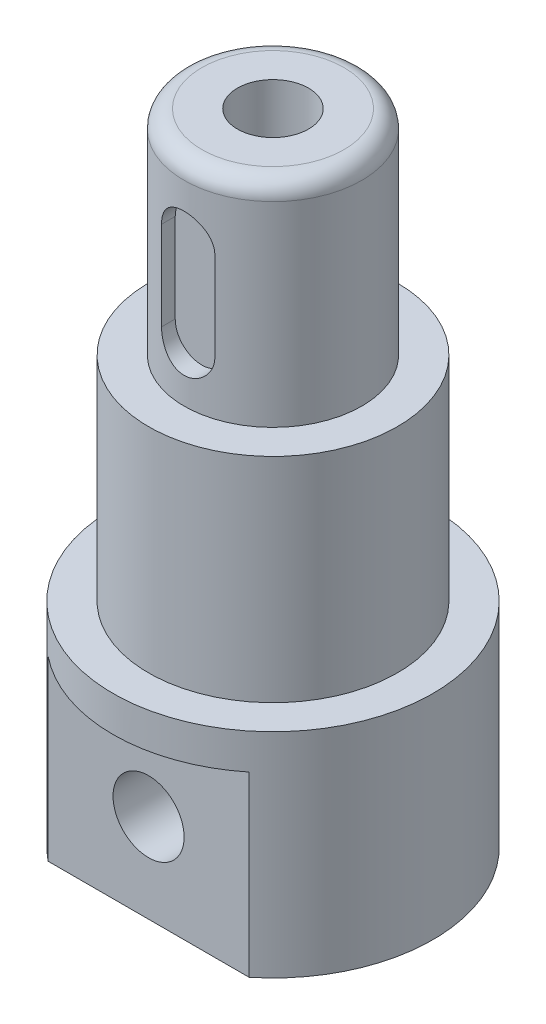
ISO-10303-21;
HEADER;
FILE_DESCRIPTION(('STEP AP214'),'2;1');
FILE_NAME('part.step','',(''),(''),'','','');
FILE_SCHEMA(('AUTOMOTIVE_DESIGN { 1 0 10303 214 1 1 1 1 }'));
ENDSEC;
DATA;
#1=APPLICATION_CONTEXT('core data for automotive mechanical design processes');
#2=APPLICATION_PROTOCOL_DEFINITION('international standard','automotive_design',2000,#1);
#3=PRODUCT_CONTEXT('',#1,'mechanical');
#4=PRODUCT('Part','Part','',(#3));
#5=PRODUCT_RELATED_PRODUCT_CATEGORY('part','',(#4));
#6=PRODUCT_DEFINITION_FORMATION('','',#4);
#7=PRODUCT_DEFINITION_CONTEXT('part definition',#1,'design');
#8=PRODUCT_DEFINITION('design','',#6,#7);
#9=PRODUCT_DEFINITION_SHAPE('','',#8);
#10=(LENGTH_UNIT() NAMED_UNIT(*) SI_UNIT(.MILLI.,.METRE.));
#11=(NAMED_UNIT(*) PLANE_ANGLE_UNIT() SI_UNIT($,.RADIAN.));
#12=(NAMED_UNIT(*) SI_UNIT($,.STERADIAN.) SOLID_ANGLE_UNIT());
#13=UNCERTAINTY_MEASURE_WITH_UNIT(LENGTH_MEASURE(1.E-05),#10,'distance_accuracy_value','');
#14=(GEOMETRIC_REPRESENTATION_CONTEXT(3) GLOBAL_UNCERTAINTY_ASSIGNED_CONTEXT((#13)) GLOBAL_UNIT_ASSIGNED_CONTEXT((#10,
#11,#12)) REPRESENTATION_CONTEXT('',''));
#15=CARTESIAN_POINT('',(0.,0.,0.));
#16=DIRECTION('',(0.,0.,1.));
#17=DIRECTION('',(1.,0.,0.));
#18=AXIS2_PLACEMENT_3D('',#15,#16,#17);
#19=CARTESIAN_POINT('',(0.,-36.,0.));
#20=DIRECTION('',(0.,-1.,0.));
#21=DIRECTION('',(0.,0.,-1.));
#22=AXIS2_PLACEMENT_3D('',#19,#20,#21);
#23=CYLINDRICAL_SURFACE('',#22,10.);
#24=CARTESIAN_POINT('',(-3.,28.,-9.53939201416945));
#25=CARTESIAN_POINT('',(-3.00001027845728,28.0823355208227,-9.53938054248206));
#26=CARTESIAN_POINT('',(-2.99661062684473,28.1646644550632,-9.54045772064378));
#27=CARTESIAN_POINT('',(-2.98307142899347,28.3286939527655,-9.54470412105986));
#28=CARTESIAN_POINT('',(-2.97293339805419,28.4103946533244,-9.54787287296848));
#29=CARTESIAN_POINT('',(-2.94603140625045,28.5723849156732,-9.55620668351003));
#30=CARTESIAN_POINT('',(-2.92928426957737,28.652677524043,-9.56136667250114));
#31=CARTESIAN_POINT('',(-2.88932853030395,28.8114758441342,-9.57351626651178));
#32=CARTESIAN_POINT('',(-2.86611975872641,28.8899815090674,-9.58050591937827));
#33=CARTESIAN_POINT('',(-2.78708584446025,29.1219493879901,-9.60391637654136));
#34=CARTESIAN_POINT('',(-2.72181852542973,29.272068438833,-9.6227900783039));
#35=CARTESIAN_POINT('',(-2.56815043531276,29.559226043979,-9.66493213967819));
#36=CARTESIAN_POINT('',(-2.4797388992416,29.6962584707622,-9.6882025429064));
#37=CARTESIAN_POINT('',(-2.27929879634443,29.9577229879478,-9.73733650515374));
#38=CARTESIAN_POINT('',(-2.16666914746585,30.0816848740609,-9.76325505469873));
#39=CARTESIAN_POINT('',(-1.92227736150434,30.3092736148388,-9.81429628475077));
#40=CARTESIAN_POINT('',(-1.79051199848164,30.412897033861,-9.8394188301941));
#41=CARTESIAN_POINT('',(-1.50821997465698,30.5989268650946,-9.88666477976534));
#42=CARTESIAN_POINT('',(-1.35736167401016,30.6808501797826,-9.90871541546877));
#43=CARTESIAN_POINT('',(-1.04324233568303,30.8179770040029,-9.94668940088144));
#44=CARTESIAN_POINT('',(-0.879984508687991,30.873187403368,-9.96261433032402));
#45=CARTESIAN_POINT('',(-0.550649404820607,30.953759551791,-9.98615279768397));
#46=CARTESIAN_POINT('',(-0.384786253016209,30.9799297035176,-9.99399098526792));
#47=CARTESIAN_POINT('',(-0.0508471415689336,31.004234695146,-10.0012640407204));
#48=CARTESIAN_POINT('',(0.117228393125333,31.0023748426782,-10.0007004995012));
#49=CARTESIAN_POINT('',(0.445143199271819,30.9712141793086,-9.99139205125586));
#50=CARTESIAN_POINT('',(0.605074290763023,30.9427893091919,-9.98290831016512));
#51=CARTESIAN_POINT('',(0.917780104370309,30.8607367303745,-9.95903027401822));
#52=CARTESIAN_POINT('',(1.07055445110878,30.8071077013173,-9.94363561692558));
#53=CARTESIAN_POINT('',(1.36669563173911,30.6755755564753,-9.90730429851782));
#54=CARTESIAN_POINT('',(1.50993201207612,30.5973967112239,-9.88630511384915));
#55=CARTESIAN_POINT('',(1.781531059161,30.4192028199656,-9.84099249303646));
#56=CARTESIAN_POINT('',(1.9098903832325,30.3191828810593,-9.81667831471806));
#57=CARTESIAN_POINT('',(2.15330901082205,30.0956160238154,-9.7662334714278));
#58=CARTESIAN_POINT('',(2.26766702955975,29.9713122724738,-9.74006890899097));
#59=CARTESIAN_POINT('',(2.47413538985067,29.7050051531489,-9.68968430229327));
#60=CARTESIAN_POINT('',(2.5662392402618,29.5629966392702,-9.66546482675134));
#61=CARTESIAN_POINT('',(2.72632814481701,29.2634381431001,-9.62154457591303));
#62=CARTESIAN_POINT('',(2.79406012682262,29.1057456408129,-9.60189192491895));
#63=CARTESIAN_POINT('',(2.90171772009404,28.7805509920369,-9.56991327306402));
#64=CARTESIAN_POINT('',(2.94168586436072,28.6130642785713,-9.55757606951749));
#65=CARTESIAN_POINT('',(2.97802407180159,28.3700102218596,-9.54628064650011));
#66=CARTESIAN_POINT('',(2.98626405978017,28.2962185316408,-9.54370312550533));
#67=CARTESIAN_POINT('',(2.99724711229709,28.148297041801,-9.54025857223564));
#68=CARTESIAN_POINT('',(2.99999825936538,28.0741679006723,-9.53938902493287));
#69=CARTESIAN_POINT('',(3.,28.,-9.53939201416945));
#70=B_SPLINE_CURVE_WITH_KNOTS('',3,(#24,#25,#26,#27,#28,#29,#30,#31,#32,#33,#34,#35,#36,#37,#38,
#39,#40,#41,#42,#43,#44,#45,#46,#47,#48,#49,#50,#51,#52,#53,#54,#55,#56,#57,#58,#59,#60,#61,#62,
#63,#64,#65,#66,#67,#68,#69),.UNSPECIFIED.,.F.,.F.,(4,2,2,2,2,2,2,2,2,2,2,2,2,2,2,2,2,2,2,2,2,2,
4),(0.,0.246918142439467,0.493780777706087,0.740019009623012,0.986263681482023,1.47813347402025,
1.97023245590779,2.47635119822766,2.98255536239032,3.4992281062007,4.01576751791672,
4.51753600864764,5.01920948804101,5.50490358251093,5.99062312360831,6.48200583350621,
6.9734987373917,7.48389234847122,7.99443465298715,8.51013494368214,9.02504345105574,
9.24774267716777,9.47011372732392),.UNSPECIFIED.);
#71=CARTESIAN_POINT('',(-3.,28.,-9.53939201416946));
#72=VERTEX_POINT('',#71);
#73=CARTESIAN_POINT('',(3.,28.,-9.53939201416945));
#74=VERTEX_POINT('',#73);
#75=EDGE_CURVE('E301',#72,#74,#70,.T.);
#76=ORIENTED_EDGE('',*,*,#75,.F.);
#77=DIRECTION('',(0.,-1.,0.));
#78=VECTOR('',#77,1.);
#79=CARTESIAN_POINT('',(-2.99999999999999,-36.,-9.53939201416946));
#80=LINE('',#79,#78);
#81=CARTESIAN_POINT('',(-2.99999999999999,18.,-9.53939201416946));
#82=VERTEX_POINT('',#81);
#83=EDGE_CURVE('E267',#82,#72,#80,.F.);
#84=ORIENTED_EDGE('',*,*,#83,.F.);
#85=CARTESIAN_POINT('',(3.,18.,-9.53939201416945));
#86=CARTESIAN_POINT('',(3.00001027845728,17.9176644791773,-9.53938054248206));
#87=CARTESIAN_POINT('',(2.99661062684473,17.8353355449368,-9.54045772064378));
#88=CARTESIAN_POINT('',(2.98307142899347,17.6713060472345,-9.54470412105986));
#89=CARTESIAN_POINT('',(2.97293339805419,17.5896053466756,-9.54787287296848));
#90=CARTESIAN_POINT('',(2.94603140625045,17.4276150843268,-9.55620668351003));
#91=CARTESIAN_POINT('',(2.92928426957737,17.347322475957,-9.56136667250114));
#92=CARTESIAN_POINT('',(2.88932853030395,17.1885241558658,-9.57351626651178));
#93=CARTESIAN_POINT('',(2.86611975872641,17.1100184909326,-9.58050591937827));
#94=CARTESIAN_POINT('',(2.78708584446024,16.8780506120099,-9.60391637654136));
#95=CARTESIAN_POINT('',(2.72181852542972,16.727931561167,-9.6227900783039));
#96=CARTESIAN_POINT('',(2.56815043531276,16.440773956021,-9.66493213967819));
#97=CARTESIAN_POINT('',(2.4797388992416,16.3037415292378,-9.6882025429064));
#98=CARTESIAN_POINT('',(2.27929879634443,16.0422770120522,-9.73733650515374));
#99=CARTESIAN_POINT('',(2.16666914746584,15.9183151259391,-9.76325505469873));
#100=CARTESIAN_POINT('',(1.92227736150433,15.6907263851612,-9.81429628475077));
#101=CARTESIAN_POINT('',(1.79051199848164,15.587102966139,-9.8394188301941));
#102=CARTESIAN_POINT('',(1.50821997465697,15.4010731349054,-9.88666477976534));
#103=CARTESIAN_POINT('',(1.35736167401016,15.3191498202174,-9.90871541546877));
#104=CARTESIAN_POINT('',(1.04324233568303,15.1820229959971,-9.94668940088144));
#105=CARTESIAN_POINT('',(0.879984508687984,15.1268125966321,-9.96261433032402));
#106=CARTESIAN_POINT('',(0.550649404820601,15.046240448209,-9.98615279768397));
#107=CARTESIAN_POINT('',(0.384786253016202,15.0200702964824,-9.99399098526792));
#108=CARTESIAN_POINT('',(0.0508471415689268,14.995765304854,-10.0012640407204));
#109=CARTESIAN_POINT('',(-0.11722839312534,14.9976251573218,-10.0007004995012));
#110=CARTESIAN_POINT('',(-0.445143199271825,15.0287858206914,-9.99139205125586));
#111=CARTESIAN_POINT('',(-0.605074290763028,15.0572106908081,-9.98290831016512));
#112=CARTESIAN_POINT('',(-0.917780104370314,15.1392632696255,-9.95903027401822));
#113=CARTESIAN_POINT('',(-1.07055445110879,15.1928922986827,-9.94363561692558));
#114=CARTESIAN_POINT('',(-1.36669563173912,15.3244244435248,-9.90730429851782));
#115=CARTESIAN_POINT('',(-1.50993201207613,15.4026032887761,-9.88630511384915));
#116=CARTESIAN_POINT('',(-1.781531059161,15.5807971800344,-9.84099249303646));
#117=CARTESIAN_POINT('',(-1.90989038323251,15.6808171189407,-9.81667831471806));
#118=CARTESIAN_POINT('',(-2.15330901082206,15.9043839761846,-9.7662334714278));
#119=CARTESIAN_POINT('',(-2.26766702955975,16.0286877275262,-9.74006890899097));
#120=CARTESIAN_POINT('',(-2.47413538985067,16.2949948468511,-9.68968430229327));
#121=CARTESIAN_POINT('',(-2.5662392402618,16.4370033607298,-9.66546482675133));
#122=CARTESIAN_POINT('',(-2.72632814481701,16.7365618568999,-9.62154457591303));
#123=CARTESIAN_POINT('',(-2.79406012682263,16.8942543591872,-9.60189192491895));
#124=CARTESIAN_POINT('',(-2.90171772009404,17.2194490079632,-9.56991327306402));
#125=CARTESIAN_POINT('',(-2.94168586436072,17.3869357214287,-9.55757606951749));
#126=CARTESIAN_POINT('',(-2.97802407180159,17.6299897781404,-9.54628064650011));
#127=CARTESIAN_POINT('',(-2.98626405978017,17.7037814683592,-9.54370312550533));
#128=CARTESIAN_POINT('',(-2.99724711229708,17.851702958199,-9.54025857223564));
#129=CARTESIAN_POINT('',(-2.99999825936538,17.9258320993277,-9.53938902493287));
#130=CARTESIAN_POINT('',(-3.,18.,-9.53939201416945));
#131=B_SPLINE_CURVE_WITH_KNOTS('',3,(#85,#86,#87,#88,#89,#90,#91,#92,#93,#94,#95,#96,#97,#98,
#99,#100,#101,#102,#103,#104,#105,#106,#107,#108,#109,#110,#111,#112,#113,#114,#115,#116,#117,
#118,#119,#120,#121,#122,#123,#124,#125,#126,#127,#128,#129,#130),.UNSPECIFIED.,.F.,.F.,(4,2,2,
2,2,2,2,2,2,2,2,2,2,2,2,2,2,2,2,2,2,2,4),(0.,0.246918142439467,0.493780777706087,
0.740019009623012,0.986263681482027,1.47813347402026,1.97023245590779,2.47635119822767,
2.98255536239033,3.49922810620071,4.01576751791672,4.51753600864764,5.01920948804101,
5.50490358251093,5.99062312360832,6.48200583350621,6.9734987373917,7.48389234847123,
7.99443465298716,8.51013494368215,9.02504345105574,9.24774267716778,9.47011372732391),.UNSPECIFIED.);
#132=CARTESIAN_POINT('',(3.,18.,-9.53939201416945));
#133=VERTEX_POINT('',#132);
#134=EDGE_CURVE('E269',#133,#82,#131,.T.);
#135=ORIENTED_EDGE('',*,*,#134,.F.);
#136=DIRECTION('',(0.,-1.,0.));
#137=VECTOR('',#136,1.);
#138=CARTESIAN_POINT('',(3.00000000000001,-36.,-9.53939201416945));
#139=LINE('',#138,#137);
#140=EDGE_CURVE('E276',#74,#133,#139,.T.);
#141=ORIENTED_EDGE('',*,*,#140,.F.);
#142=EDGE_LOOP('',(#76,#84,#135,#141));
#143=FACE_BOUND('',#142,.T.);
#144=CARTESIAN_POINT('',(0.,34.,0.));
#145=DIRECTION('',(0.,-1.,0.));
#146=DIRECTION('',(0.,0.,-1.));
#147=AXIS2_PLACEMENT_3D('',#144,#145,#146);
#148=CIRCLE('',#147,10.);
#149=CARTESIAN_POINT('',(0.,34.,-10.));
#150=VERTEX_POINT('',#149);
#151=EDGE_CURVE('E231',#150,#150,#148,.T.);
#152=ORIENTED_EDGE('',*,*,#151,.T.);
#153=EDGE_LOOP('',(#152));
#154=FACE_BOUND('',#153,.T.);
#155=CARTESIAN_POINT('',(0.,12.,0.));
#156=DIRECTION('',(0.,-1.,0.));
#157=DIRECTION('',(0.,0.,-1.));
#158=AXIS2_PLACEMENT_3D('',#155,#156,#157);
#159=CIRCLE('',#158,10.);
#160=CARTESIAN_POINT('',(0.,12.,-10.));
#161=VERTEX_POINT('',#160);
#162=EDGE_CURVE('E234',#161,#161,#159,.T.);
#163=ORIENTED_EDGE('',*,*,#162,.F.);
#164=EDGE_LOOP('',(#163));
#165=FACE_BOUND('',#164,.T.);
#166=DIRECTION('',(0.,-1.,0.));
#167=VECTOR('',#166,1.);
#168=CARTESIAN_POINT('',(-2.99999999999999,-36.,9.53939201416946));
#169=LINE('',#168,#167);
#170=CARTESIAN_POINT('',(-3.,18.,9.53939201416945));
#171=VERTEX_POINT('',#170);
#172=CARTESIAN_POINT('',(-3.,28.,9.53939201416946));
#173=VERTEX_POINT('',#172);
#174=EDGE_CURVE('E58',#171,#173,#169,.F.);
#175=ORIENTED_EDGE('',*,*,#174,.T.);
#176=CARTESIAN_POINT('',(-3.,28.,9.53939201416945));
#177=CARTESIAN_POINT('',(-3.00001027845728,28.0823355208227,9.53938054248206));
#178=CARTESIAN_POINT('',(-2.99661062684473,28.1646644550632,9.54045772064378));
#179=CARTESIAN_POINT('',(-2.98307142899347,28.3286939527655,9.54470412105986));
#180=CARTESIAN_POINT('',(-2.97293339805419,28.4103946533244,9.54787287296848));
#181=CARTESIAN_POINT('',(-2.94603140625045,28.5723849156732,9.55620668351003));
#182=CARTESIAN_POINT('',(-2.92928426957737,28.652677524043,9.56136667250114));
#183=CARTESIAN_POINT('',(-2.88932853030395,28.8114758441342,9.57351626651178));
#184=CARTESIAN_POINT('',(-2.86611975872641,28.8899815090674,9.58050591937827));
#185=CARTESIAN_POINT('',(-2.78708584446025,29.1219493879901,9.60391637654136));
#186=CARTESIAN_POINT('',(-2.72181852542973,29.272068438833,9.6227900783039));
#187=CARTESIAN_POINT('',(-2.56815043531276,29.559226043979,9.66493213967819));
#188=CARTESIAN_POINT('',(-2.4797388992416,29.6962584707622,9.6882025429064));
#189=CARTESIAN_POINT('',(-2.27929879634443,29.9577229879478,9.73733650515374));
#190=CARTESIAN_POINT('',(-2.16666914746585,30.0816848740609,9.76325505469873));
#191=CARTESIAN_POINT('',(-1.92227736150434,30.3092736148388,9.81429628475077));
#192=CARTESIAN_POINT('',(-1.79051199848164,30.412897033861,9.8394188301941));
#193=CARTESIAN_POINT('',(-1.50821997465698,30.5989268650946,9.88666477976534));
#194=CARTESIAN_POINT('',(-1.35736167401016,30.6808501797826,9.90871541546877));
#195=CARTESIAN_POINT('',(-1.04324233568303,30.8179770040029,9.94668940088144));
#196=CARTESIAN_POINT('',(-0.879984508687991,30.873187403368,9.96261433032402));
#197=CARTESIAN_POINT('',(-0.550649404820607,30.953759551791,9.98615279768397));
#198=CARTESIAN_POINT('',(-0.384786253016209,30.9799297035176,9.99399098526792));
#199=CARTESIAN_POINT('',(-0.0508471415689336,31.004234695146,10.0012640407204));
#200=CARTESIAN_POINT('',(0.117228393125333,31.0023748426782,10.0007004995012));
#201=CARTESIAN_POINT('',(0.445143199271819,30.9712141793086,9.99139205125586));
#202=CARTESIAN_POINT('',(0.605074290763023,30.9427893091919,9.98290831016512));
#203=CARTESIAN_POINT('',(0.917780104370309,30.8607367303745,9.95903027401822));
#204=CARTESIAN_POINT('',(1.07055445110878,30.8071077013173,9.94363561692558));
#205=CARTESIAN_POINT('',(1.36669563173911,30.6755755564753,9.90730429851782));
#206=CARTESIAN_POINT('',(1.50993201207612,30.5973967112239,9.88630511384915));
#207=CARTESIAN_POINT('',(1.781531059161,30.4192028199656,9.84099249303646));
#208=CARTESIAN_POINT('',(1.9098903832325,30.3191828810593,9.81667831471806));
#209=CARTESIAN_POINT('',(2.15330901082205,30.0956160238154,9.7662334714278));
#210=CARTESIAN_POINT('',(2.26766702955975,29.9713122724738,9.74006890899097));
#211=CARTESIAN_POINT('',(2.47413538985067,29.7050051531489,9.68968430229327));
#212=CARTESIAN_POINT('',(2.5662392402618,29.5629966392702,9.66546482675134));
#213=CARTESIAN_POINT('',(2.72632814481701,29.2634381431001,9.62154457591303));
#214=CARTESIAN_POINT('',(2.79406012682262,29.1057456408129,9.60189192491895));
#215=CARTESIAN_POINT('',(2.90171772009404,28.7805509920369,9.56991327306402));
#216=CARTESIAN_POINT('',(2.94168586436072,28.6130642785713,9.55757606951749));
#217=CARTESIAN_POINT('',(2.97802407180159,28.3700102218596,9.54628064650011));
#218=CARTESIAN_POINT('',(2.98626405978017,28.2962185316408,9.54370312550533));
#219=CARTESIAN_POINT('',(2.99724711229709,28.148297041801,9.54025857223564));
#220=CARTESIAN_POINT('',(2.99999825936538,28.0741679006723,9.53938902493287));
#221=CARTESIAN_POINT('',(3.,28.,9.53939201416945));
#222=B_SPLINE_CURVE_WITH_KNOTS('',3,(#176,#177,#178,#179,#180,#181,#182,#183,#184,#185,#186,
#187,#188,#189,#190,#191,#192,#193,#194,#195,#196,#197,#198,#199,#200,#201,#202,#203,#204,#205,
#206,#207,#208,#209,#210,#211,#212,#213,#214,#215,#216,#217,#218,#219,#220,#221),.UNSPECIFIED.,
.F.,.F.,(4,2,2,2,2,2,2,2,2,2,2,2,2,2,2,2,2,2,2,2,2,2,4),(0.,0.246918142439467,0.493780777706087,
0.740019009623012,0.986263681482023,1.47813347402025,1.97023245590779,2.47635119822766,
2.98255536239032,3.4992281062007,4.01576751791672,4.51753600864764,5.01920948804101,
5.50490358251093,5.99062312360831,6.48200583350621,6.9734987373917,7.48389234847122,
7.99443465298715,8.51013494368214,9.02504345105574,9.24774267716777,9.47011372732392),.UNSPECIFIED.);
#223=CARTESIAN_POINT('',(3.,28.,9.53939201416945));
#224=VERTEX_POINT('',#223);
#225=EDGE_CURVE('E13',#173,#224,#222,.T.);
#226=ORIENTED_EDGE('',*,*,#225,.T.);
#227=DIRECTION('',(0.,-1.,0.));
#228=VECTOR('',#227,1.);
#229=CARTESIAN_POINT('',(3.00000000000001,-36.,9.53939201416945));
#230=LINE('',#229,#228);
#231=CARTESIAN_POINT('',(3.00000000000001,18.,9.53939201416945));
#232=VERTEX_POINT('',#231);
#233=EDGE_CURVE('E307',#224,#232,#230,.T.);
#234=ORIENTED_EDGE('',*,*,#233,.T.);
#235=CARTESIAN_POINT('',(3.,18.,9.53939201416945));
#236=CARTESIAN_POINT('',(3.00001027845728,17.9176644791773,9.53938054248206));
#237=CARTESIAN_POINT('',(2.99661062684473,17.8353355449368,9.54045772064378));
#238=CARTESIAN_POINT('',(2.98307142899347,17.6713060472345,9.54470412105986));
#239=CARTESIAN_POINT('',(2.97293339805419,17.5896053466756,9.54787287296848));
#240=CARTESIAN_POINT('',(2.94603140625045,17.4276150843268,9.55620668351003));
#241=CARTESIAN_POINT('',(2.92928426957737,17.347322475957,9.56136667250114));
#242=CARTESIAN_POINT('',(2.88932853030395,17.1885241558658,9.57351626651178));
#243=CARTESIAN_POINT('',(2.86611975872641,17.1100184909326,9.58050591937827));
#244=CARTESIAN_POINT('',(2.78708584446024,16.8780506120099,9.60391637654136));
#245=CARTESIAN_POINT('',(2.72181852542972,16.727931561167,9.6227900783039));
#246=CARTESIAN_POINT('',(2.56815043531276,16.440773956021,9.66493213967819));
#247=CARTESIAN_POINT('',(2.4797388992416,16.3037415292378,9.6882025429064));
#248=CARTESIAN_POINT('',(2.27929879634443,16.0422770120522,9.73733650515374));
#249=CARTESIAN_POINT('',(2.16666914746584,15.9183151259391,9.76325505469873));
#250=CARTESIAN_POINT('',(1.92227736150433,15.6907263851612,9.81429628475077));
#251=CARTESIAN_POINT('',(1.79051199848164,15.587102966139,9.8394188301941));
#252=CARTESIAN_POINT('',(1.50821997465697,15.4010731349054,9.88666477976534));
#253=CARTESIAN_POINT('',(1.35736167401016,15.3191498202174,9.90871541546877));
#254=CARTESIAN_POINT('',(1.04324233568303,15.1820229959971,9.94668940088144));
#255=CARTESIAN_POINT('',(0.879984508687984,15.1268125966321,9.96261433032402));
#256=CARTESIAN_POINT('',(0.550649404820601,15.046240448209,9.98615279768397));
#257=CARTESIAN_POINT('',(0.384786253016202,15.0200702964824,9.99399098526792));
#258=CARTESIAN_POINT('',(0.0508471415689268,14.995765304854,10.0012640407204));
#259=CARTESIAN_POINT('',(-0.11722839312534,14.9976251573218,10.0007004995012));
#260=CARTESIAN_POINT('',(-0.445143199271825,15.0287858206914,9.99139205125586));
#261=CARTESIAN_POINT('',(-0.605074290763028,15.0572106908081,9.98290831016512));
#262=CARTESIAN_POINT('',(-0.917780104370314,15.1392632696255,9.95903027401822));
#263=CARTESIAN_POINT('',(-1.07055445110879,15.1928922986827,9.94363561692558));
#264=CARTESIAN_POINT('',(-1.36669563173912,15.3244244435248,9.90730429851782));
#265=CARTESIAN_POINT('',(-1.50993201207613,15.4026032887761,9.88630511384915));
#266=CARTESIAN_POINT('',(-1.781531059161,15.5807971800344,9.84099249303646));
#267=CARTESIAN_POINT('',(-1.90989038323251,15.6808171189407,9.81667831471806));
#268=CARTESIAN_POINT('',(-2.15330901082206,15.9043839761846,9.7662334714278));
#269=CARTESIAN_POINT('',(-2.26766702955975,16.0286877275262,9.74006890899097));
#270=CARTESIAN_POINT('',(-2.47413538985067,16.2949948468511,9.68968430229327));
#271=CARTESIAN_POINT('',(-2.5662392402618,16.4370033607298,9.66546482675133));
#272=CARTESIAN_POINT('',(-2.72632814481701,16.7365618568999,9.62154457591303));
#273=CARTESIAN_POINT('',(-2.79406012682263,16.8942543591872,9.60189192491895));
#274=CARTESIAN_POINT('',(-2.90171772009404,17.2194490079632,9.56991327306402));
#275=CARTESIAN_POINT('',(-2.94168586436072,17.3869357214287,9.55757606951749));
#276=CARTESIAN_POINT('',(-2.97802407180159,17.6299897781404,9.54628064650011));
#277=CARTESIAN_POINT('',(-2.98626405978017,17.7037814683592,9.54370312550533));
#278=CARTESIAN_POINT('',(-2.99724711229708,17.851702958199,9.54025857223564));
#279=CARTESIAN_POINT('',(-2.99999825936538,17.9258320993277,9.53938902493287));
#280=CARTESIAN_POINT('',(-3.,18.,9.53939201416945));
#281=B_SPLINE_CURVE_WITH_KNOTS('',3,(#235,#236,#237,#238,#239,#240,#241,#242,#243,#244,#245,
#246,#247,#248,#249,#250,#251,#252,#253,#254,#255,#256,#257,#258,#259,#260,#261,#262,#263,#264,
#265,#266,#267,#268,#269,#270,#271,#272,#273,#274,#275,#276,#277,#278,#279,#280),.UNSPECIFIED.,
.F.,.F.,(4,2,2,2,2,2,2,2,2,2,2,2,2,2,2,2,2,2,2,2,2,2,4),(0.,0.246918142439467,0.493780777706087,
0.740019009623012,0.986263681482027,1.47813347402026,1.97023245590779,2.47635119822767,
2.98255536239033,3.49922810620071,4.01576751791672,4.51753600864764,5.01920948804101,
5.50490358251093,5.99062312360832,6.48200583350621,6.9734987373917,7.48389234847123,
7.99443465298716,8.51013494368215,9.02504345105574,9.24774267716778,9.47011372732391),.UNSPECIFIED.);
#282=EDGE_CURVE('E310',#232,#171,#281,.T.);
#283=ORIENTED_EDGE('',*,*,#282,.T.);
#284=EDGE_LOOP('',(#175,#226,#234,#283));
#285=FACE_BOUND('',#284,.T.);
#286=ADVANCED_FACE('F44',(#143,#154,#165,#285),#23,.T.);
#287=CARTESIAN_POINT('',(4.00000000000001,-36.,0.));
#288=DIRECTION('',(0.,-1.,0.));
#289=DIRECTION('',(0.,0.,-1.));
#290=AXIS2_PLACEMENT_3D('',#287,#288,#289);
#291=PLANE('',#290);
#292=CARTESIAN_POINT('',(0.,-36.,0.));
#293=DIRECTION('',(0.,-1.,0.));
#294=DIRECTION('',(0.,0.,-1.));
#295=AXIS2_PLACEMENT_3D('',#292,#293,#294);
#296=CIRCLE('',#295,4.00000000000001);
#297=CARTESIAN_POINT('',(0.,-36.,-4.00000000000001));
#298=VERTEX_POINT('',#297);
#299=EDGE_CURVE('E222',#298,#298,#296,.T.);
#300=ORIENTED_EDGE('',*,*,#299,.F.);
#301=EDGE_LOOP('',(#300));
#302=FACE_BOUND('',#301,.T.);
#303=CARTESIAN_POINT('',(0.,-36.,0.));
#304=DIRECTION('',(0.,-1.,0.));
#305=DIRECTION('',(0.,0.,-1.));
#306=AXIS2_PLACEMENT_3D('',#303,#304,#305);
#307=CIRCLE('',#306,18.);
#308=CARTESIAN_POINT('',(11.3137084989848,-36.,-14.));
#309=VERTEX_POINT('',#308);
#310=CARTESIAN_POINT('',(11.3137084989848,-36.,14.));
#311=VERTEX_POINT('',#310);
#312=EDGE_CURVE('E247',#309,#311,#307,.T.);
#313=ORIENTED_EDGE('',*,*,#312,.T.);
#314=DIRECTION('',(-1.,0.,0.));
#315=VECTOR('',#314,1.);
#316=CARTESIAN_POINT('',(4.00000000000001,-36.,14.));
#317=LINE('',#316,#315);
#318=CARTESIAN_POINT('',(-11.3137084989848,-36.,14.));
#319=VERTEX_POINT('',#318);
#320=EDGE_CURVE('E202',#311,#319,#317,.T.);
#321=ORIENTED_EDGE('',*,*,#320,.T.);
#322=CARTESIAN_POINT('',(-11.3137084989848,-36.,-14.));
#323=VERTEX_POINT('',#322);
#324=EDGE_CURVE('E246',#319,#323,#307,.T.);
#325=ORIENTED_EDGE('',*,*,#324,.T.);
#326=DIRECTION('',(-1.,0.,0.));
#327=VECTOR('',#326,1.);
#328=CARTESIAN_POINT('',(4.00000000000001,-36.,-14.));
#329=LINE('',#328,#327);
#330=EDGE_CURVE('E216',#309,#323,#329,.T.);
#331=ORIENTED_EDGE('',*,*,#330,.F.);
#332=EDGE_LOOP('',(#313,#321,#325,#331));
#333=FACE_BOUND('',#332,.T.);
#334=ADVANCED_FACE('F46',(#302,#333),#291,.T.);
#335=CARTESIAN_POINT('',(0.,-36.,0.));
#336=DIRECTION('',(0.,-1.,0.));
#337=DIRECTION('',(0.,0.,-1.));
#338=AXIS2_PLACEMENT_3D('',#335,#336,#337);
#339=CYLINDRICAL_SURFACE('',#338,18.);
#340=CARTESIAN_POINT('',(0.,-12.,0.));
#341=DIRECTION('',(0.,-1.,0.));
#342=DIRECTION('',(0.,0.,-1.));
#343=AXIS2_PLACEMENT_3D('',#340,#341,#342);
#344=CIRCLE('',#343,18.);
#345=CARTESIAN_POINT('',(0.,-12.,-18.));
#346=VERTEX_POINT('',#345);
#347=EDGE_CURVE('E243',#346,#346,#344,.T.);
#348=ORIENTED_EDGE('',*,*,#347,.T.);
#349=EDGE_LOOP('',(#348));
#350=FACE_BOUND('',#349,.T.);
#351=ORIENTED_EDGE('',*,*,#324,.F.);
#352=DIRECTION('',(0.,-1.,0.));
#353=VECTOR('',#352,1.);
#354=CARTESIAN_POINT('',(-11.3137084989848,-36.,14.));
#355=LINE('',#354,#353);
#356=CARTESIAN_POINT('',(-11.3137084989848,-16.,14.));
#357=VERTEX_POINT('',#356);
#358=EDGE_CURVE('E205',#319,#357,#355,.F.);
#359=ORIENTED_EDGE('',*,*,#358,.T.);
#360=CARTESIAN_POINT('',(0.,-16.,0.));
#361=DIRECTION('',(0.,-1.,0.));
#362=DIRECTION('',(0.,0.,-1.));
#363=AXIS2_PLACEMENT_3D('',#360,#361,#362);
#364=CIRCLE('',#363,18.);
#365=CARTESIAN_POINT('',(11.3137084989848,-16.,14.));
#366=VERTEX_POINT('',#365);
#367=EDGE_CURVE('E264',#357,#366,#364,.F.);
#368=ORIENTED_EDGE('',*,*,#367,.T.);
#369=DIRECTION('',(0.,-1.,0.));
#370=VECTOR('',#369,1.);
#371=CARTESIAN_POINT('',(11.3137084989848,-36.,14.));
#372=LINE('',#371,#370);
#373=EDGE_CURVE('E199',#366,#311,#372,.T.);
#374=ORIENTED_EDGE('',*,*,#373,.T.);
#375=ORIENTED_EDGE('',*,*,#312,.F.);
#376=DIRECTION('',(0.,-1.,0.));
#377=VECTOR('',#376,1.);
#378=CARTESIAN_POINT('',(11.3137084989848,-36.,-14.));
#379=LINE('',#378,#377);
#380=CARTESIAN_POINT('',(11.3137084989848,-16.,-14.));
#381=VERTEX_POINT('',#380);
#382=EDGE_CURVE('E214',#381,#309,#379,.T.);
#383=ORIENTED_EDGE('',*,*,#382,.F.);
#384=CARTESIAN_POINT('',(0.,-16.,0.));
#385=DIRECTION('',(0.,1.,0.));
#386=DIRECTION('',(0.,0.,1.));
#387=AXIS2_PLACEMENT_3D('',#384,#385,#386);
#388=CIRCLE('',#387,18.);
#389=CARTESIAN_POINT('',(-11.3137084989848,-16.,-14.));
#390=VERTEX_POINT('',#389);
#391=EDGE_CURVE('E261',#390,#381,#388,.F.);
#392=ORIENTED_EDGE('',*,*,#391,.F.);
#393=DIRECTION('',(0.,-1.,0.));
#394=VECTOR('',#393,1.);
#395=CARTESIAN_POINT('',(-11.3137084989848,-36.,-14.));
#396=LINE('',#395,#394);
#397=EDGE_CURVE('E219',#323,#390,#396,.F.);
#398=ORIENTED_EDGE('',*,*,#397,.F.);
#399=EDGE_LOOP('',(#351,#359,#368,#374,#375,#383,#392,#398));
#400=FACE_BOUND('',#399,.T.);
#401=ADVANCED_FACE('F338',(#350,#400),#339,.T.);
#402=CARTESIAN_POINT('',(0.,-26.,-18.));
#403=DIRECTION('',(0.,0.,1.));
#404=DIRECTION('',(1.,0.,0.));
#405=AXIS2_PLACEMENT_3D('',#402,#403,#404);
#406=CYLINDRICAL_SURFACE('',#405,4.);
#407=CARTESIAN_POINT('',(0.,-26.,0.));
#408=DIRECTION('',(0.,-0.707106781186547,0.707106781186547));
#409=DIRECTION('',(0.,-0.707106781186547,-0.707106781186547));
#410=AXIS2_PLACEMENT_3D('',#407,#408,#409);
#411=ELLIPSE('',#410,5.65685424949238,4.);
#412=CARTESIAN_POINT('',(-4.,-26.,0.));
#413=VERTEX_POINT('',#412);
#414=CARTESIAN_POINT('',(4.,-26.,0.));
#415=VERTEX_POINT('',#414);
#416=EDGE_CURVE('E258',#413,#415,#411,.F.);
#417=ORIENTED_EDGE('',*,*,#416,.T.);
#418=CARTESIAN_POINT('',(0.,-26.,0.));
#419=DIRECTION('',(0.,-0.707106781186547,-0.707106781186547));
#420=DIRECTION('',(0.,-0.707106781186547,0.707106781186547));
#421=AXIS2_PLACEMENT_3D('',#418,#419,#420);
#422=ELLIPSE('',#421,5.65685424949238,4.);
#423=EDGE_CURVE('E253',#415,#413,#422,.T.);
#424=ORIENTED_EDGE('',*,*,#423,.T.);
#425=EDGE_LOOP('',(#417,#424));
#426=FACE_BOUND('',#425,.T.);
#427=CARTESIAN_POINT('',(0.,-26.,14.));
#428=DIRECTION('',(0.,0.,1.));
#429=DIRECTION('',(1.,0.,0.));
#430=AXIS2_PLACEMENT_3D('',#427,#428,#429);
#431=CIRCLE('',#430,4.);
#432=CARTESIAN_POINT('',(4.,-26.,14.));
#433=VERTEX_POINT('',#432);
#434=EDGE_CURVE('E189',#433,#433,#431,.T.);
#435=ORIENTED_EDGE('',*,*,#434,.T.);
#436=EDGE_LOOP('',(#435));
#437=FACE_BOUND('',#436,.T.);
#438=ADVANCED_FACE('F434',(#426,#437),#406,.F.);
#439=CARTESIAN_POINT('',(0.,-36.,0.));
#440=DIRECTION('',(0.,-1.,0.));
#441=DIRECTION('',(0.,0.,-1.));
#442=AXIS2_PLACEMENT_3D('',#439,#440,#441);
#443=CYLINDRICAL_SURFACE('',#442,4.);
#444=ORIENTED_EDGE('',*,*,#416,.F.);
#445=CARTESIAN_POINT('',(0.,-26.,0.));
#446=DIRECTION('',(0.,-0.707106781186547,-0.707106781186547));
#447=DIRECTION('',(0.,-0.707106781186547,0.707106781186547));
#448=AXIS2_PLACEMENT_3D('',#445,#446,#447);
#449=ELLIPSE('',#448,5.65685424949238,4.);
#450=EDGE_CURVE('E250',#415,#413,#449,.F.);
#451=ORIENTED_EDGE('',*,*,#450,.F.);
#452=EDGE_LOOP('',(#444,#451));
#453=FACE_BOUND('',#452,.T.);
#454=CARTESIAN_POINT('',(0.,36.,0.));
#455=DIRECTION('',(0.,-1.,0.));
#456=DIRECTION('',(0.,0.,-1.));
#457=AXIS2_PLACEMENT_3D('',#454,#455,#456);
#458=CIRCLE('',#457,4.);
#459=CARTESIAN_POINT('',(0.,36.,-4.));
#460=VERTEX_POINT('',#459);
#461=EDGE_CURVE('E225',#460,#460,#458,.T.);
#462=ORIENTED_EDGE('',*,*,#461,.F.);
#463=EDGE_LOOP('',(#462));
#464=FACE_BOUND('',#463,.T.);
#465=ADVANCED_FACE('F439',(#453,#464),#443,.F.);
#466=CARTESIAN_POINT('',(18.,-12.,0.));
#467=DIRECTION('',(0.,1.,0.));
#468=DIRECTION('',(0.,0.,1.));
#469=AXIS2_PLACEMENT_3D('',#466,#467,#468);
#470=PLANE('',#469);
#471=CARTESIAN_POINT('',(0.,-12.,0.));
#472=DIRECTION('',(0.,-1.,0.));
#473=DIRECTION('',(0.,0.,-1.));
#474=AXIS2_PLACEMENT_3D('',#471,#472,#473);
#475=CIRCLE('',#474,14.);
#476=CARTESIAN_POINT('',(0.,-12.,-14.));
#477=VERTEX_POINT('',#476);
#478=EDGE_CURVE('E240',#477,#477,#475,.T.);
#479=ORIENTED_EDGE('',*,*,#478,.T.);
#480=EDGE_LOOP('',(#479));
#481=FACE_BOUND('',#480,.T.);
#482=ORIENTED_EDGE('',*,*,#347,.F.);
#483=EDGE_LOOP('',(#482));
#484=FACE_BOUND('',#483,.T.);
#485=ADVANCED_FACE('F502',(#481,#484),#470,.T.);
#486=CARTESIAN_POINT('',(0.,-36.,0.));
#487=DIRECTION('',(0.,-1.,0.));
#488=DIRECTION('',(0.,0.,-1.));
#489=AXIS2_PLACEMENT_3D('',#486,#487,#488);
#490=CYLINDRICAL_SURFACE('',#489,14.);
#491=CARTESIAN_POINT('',(0.,12.,0.));
#492=DIRECTION('',(0.,-1.,0.));
#493=DIRECTION('',(0.,0.,-1.));
#494=AXIS2_PLACEMENT_3D('',#491,#492,#493);
#495=CIRCLE('',#494,14.);
#496=CARTESIAN_POINT('',(0.,12.,-14.));
#497=VERTEX_POINT('',#496);
#498=EDGE_CURVE('E237',#497,#497,#495,.T.);
#499=ORIENTED_EDGE('',*,*,#498,.T.);
#500=EDGE_LOOP('',(#499));
#501=FACE_BOUND('',#500,.T.);
#502=ORIENTED_EDGE('',*,*,#478,.F.);
#503=EDGE_LOOP('',(#502));
#504=FACE_BOUND('',#503,.T.);
#505=ADVANCED_FACE('F529',(#501,#504),#490,.T.);
#506=CARTESIAN_POINT('',(14.,12.,0.));
#507=DIRECTION('',(0.,1.,0.));
#508=DIRECTION('',(0.,0.,1.));
#509=AXIS2_PLACEMENT_3D('',#506,#507,#508);
#510=PLANE('',#509);
#511=ORIENTED_EDGE('',*,*,#162,.T.);
#512=EDGE_LOOP('',(#511));
#513=FACE_BOUND('',#512,.T.);
#514=ORIENTED_EDGE('',*,*,#498,.F.);
#515=EDGE_LOOP('',(#514));
#516=FACE_BOUND('',#515,.T.);
#517=ADVANCED_FACE('F520',(#513,#516),#510,.T.);
#518=CARTESIAN_POINT('',(0.,34.,0.));
#519=DIRECTION('',(0.,-1.,0.));
#520=DIRECTION('',(0.,0.,-1.));
#521=AXIS2_PLACEMENT_3D('',#518,#519,#520);
#522=TOROIDAL_SURFACE('',#521,8.,2.);
#523=CARTESIAN_POINT('',(0.,36.,0.));
#524=DIRECTION('',(0.,-1.,0.));
#525=DIRECTION('',(0.,0.,-1.));
#526=AXIS2_PLACEMENT_3D('',#523,#524,#525);
#527=CIRCLE('',#526,8.);
#528=CARTESIAN_POINT('',(0.,36.,-8.));
#529=VERTEX_POINT('',#528);
#530=EDGE_CURVE('E228',#529,#529,#527,.T.);
#531=ORIENTED_EDGE('',*,*,#530,.T.);
#532=EDGE_LOOP('',(#531));
#533=FACE_BOUND('',#532,.T.);
#534=ORIENTED_EDGE('',*,*,#151,.F.);
#535=EDGE_LOOP('',(#534));
#536=FACE_BOUND('',#535,.T.);
#537=ADVANCED_FACE('F510',(#533,#536),#522,.T.);
#538=CARTESIAN_POINT('',(8.,36.,0.));
#539=DIRECTION('',(0.,1.,0.));
#540=DIRECTION('',(0.,0.,1.));
#541=AXIS2_PLACEMENT_3D('',#538,#539,#540);
#542=PLANE('',#541);
#543=ORIENTED_EDGE('',*,*,#461,.T.);
#544=EDGE_LOOP('',(#543));
#545=FACE_BOUND('',#544,.T.);
#546=ORIENTED_EDGE('',*,*,#530,.F.);
#547=EDGE_LOOP('',(#546));
#548=FACE_BOUND('',#547,.T.);
#549=ADVANCED_FACE('F492',(#545,#548),#542,.T.);
#550=CARTESIAN_POINT('',(0.,-26.,0.));
#551=DIRECTION('',(0.,-0.707106781186547,0.707106781186547));
#552=DIRECTION('',(0.,-0.707106781186547,-0.707106781186547));
#553=AXIS2_PLACEMENT_3D('',#550,#551,#552);
#554=ELLIPSE('',#553,5.65685424949238,4.);
#555=EDGE_CURVE('E255',#413,#415,#554,.T.);
#556=ORIENTED_EDGE('',*,*,#555,.F.);
#557=ORIENTED_EDGE('',*,*,#423,.F.);
#558=EDGE_LOOP('',(#556,#557));
#559=FACE_BOUND('',#558,.T.);
#560=ORIENTED_EDGE('',*,*,#299,.T.);
#561=EDGE_LOOP('',(#560));
#562=FACE_BOUND('',#561,.T.);
#563=ADVANCED_FACE('F482',(#559,#562),#443,.F.);
#564=CARTESIAN_POINT('',(0.,-26.,-14.));
#565=DIRECTION('',(0.,0.,1.));
#566=DIRECTION('',(1.,0.,0.));
#567=AXIS2_PLACEMENT_3D('',#564,#565,#566);
#568=CIRCLE('',#567,4.);
#569=CARTESIAN_POINT('',(4.,-26.,-14.));
#570=VERTEX_POINT('',#569);
#571=EDGE_CURVE('E208',#570,#570,#568,.T.);
#572=ORIENTED_EDGE('',*,*,#571,.F.);
#573=EDGE_LOOP('',(#572));
#574=FACE_BOUND('',#573,.T.);
#575=ORIENTED_EDGE('',*,*,#555,.T.);
#576=ORIENTED_EDGE('',*,*,#450,.T.);
#577=EDGE_LOOP('',(#575,#576));
#578=FACE_BOUND('',#577,.T.);
#579=ADVANCED_FACE('F442',(#574,#578),#406,.F.);
#580=CARTESIAN_POINT('',(-15.,-16.,-18.));
#581=DIRECTION('',(0.,1.,0.));
#582=DIRECTION('',(0.,0.,1.));
#583=AXIS2_PLACEMENT_3D('',#580,#581,#582);
#584=PLANE('',#583);
#585=DIRECTION('',(-1.,0.,0.));
#586=VECTOR('',#585,1.);
#587=CARTESIAN_POINT('',(-15.,-16.,-14.));
#588=LINE('',#587,#586);
#589=EDGE_CURVE('E211',#381,#390,#588,.T.);
#590=ORIENTED_EDGE('',*,*,#589,.T.);
#591=ORIENTED_EDGE('',*,*,#391,.T.);
#592=EDGE_LOOP('',(#590,#591));
#593=FACE_BOUND('',#592,.T.);
#594=ADVANCED_FACE('F463',(#593),#584,.F.);
#595=CARTESIAN_POINT('',(0.,0.,-14.));
#596=DIRECTION('',(0.,0.,1.));
#597=DIRECTION('',(1.,0.,0.));
#598=AXIS2_PLACEMENT_3D('',#595,#596,#597);
#599=PLANE('',#598);
#600=ORIENTED_EDGE('',*,*,#397,.T.);
#601=ORIENTED_EDGE('',*,*,#589,.F.);
#602=ORIENTED_EDGE('',*,*,#382,.T.);
#603=ORIENTED_EDGE('',*,*,#330,.T.);
#604=EDGE_LOOP('',(#600,#601,#602,#603));
#605=FACE_BOUND('',#604,.T.);
#606=ORIENTED_EDGE('',*,*,#571,.T.);
#607=EDGE_LOOP('',(#606));
#608=FACE_BOUND('',#607,.T.);
#609=ADVANCED_FACE('F427',(#605,#608),#599,.F.);
#610=CARTESIAN_POINT('',(0.,0.,14.));
#611=DIRECTION('',(0.,0.,1.));
#612=DIRECTION('',(1.,0.,0.));
#613=AXIS2_PLACEMENT_3D('',#610,#611,#612);
#614=PLANE('',#613);
#615=ORIENTED_EDGE('',*,*,#320,.F.);
#616=ORIENTED_EDGE('',*,*,#373,.F.);
#617=DIRECTION('',(-1.,0.,0.));
#618=VECTOR('',#617,1.);
#619=CARTESIAN_POINT('',(-15.,-16.,14.));
#620=LINE('',#619,#618);
#621=EDGE_CURVE('E196',#366,#357,#620,.T.);
#622=ORIENTED_EDGE('',*,*,#621,.T.);
#623=ORIENTED_EDGE('',*,*,#358,.F.);
#624=EDGE_LOOP('',(#615,#616,#622,#623));
#625=FACE_BOUND('',#624,.T.);
#626=ORIENTED_EDGE('',*,*,#434,.F.);
#627=EDGE_LOOP('',(#626));
#628=FACE_BOUND('',#627,.T.);
#629=ADVANCED_FACE('F299',(#625,#628),#614,.T.);
#630=CARTESIAN_POINT('',(-15.,-16.,18.));
#631=DIRECTION('',(0.,-1.,0.));
#632=DIRECTION('',(0.,0.,-1.));
#633=AXIS2_PLACEMENT_3D('',#630,#631,#632);
#634=PLANE('',#633);
#635=ORIENTED_EDGE('',*,*,#621,.F.);
#636=ORIENTED_EDGE('',*,*,#367,.F.);
#637=EDGE_LOOP('',(#635,#636));
#638=FACE_BOUND('',#637,.T.);
#639=ADVANCED_FACE('F297',(#638),#634,.T.);
#640=CARTESIAN_POINT('',(0.,28.,-18.));
#641=DIRECTION('',(0.,0.,1.));
#642=DIRECTION('',(1.,0.,0.));
#643=AXIS2_PLACEMENT_3D('',#640,#641,#642);
#644=CYLINDRICAL_SURFACE('',#643,3.);
#645=ORIENTED_EDGE('',*,*,#75,.T.);
#646=DIRECTION('',(0.,0.,1.));
#647=VECTOR('',#646,1.);
#648=CARTESIAN_POINT('',(3.,28.,-18.));
#649=LINE('',#648,#647);
#650=CARTESIAN_POINT('',(3.,28.,-8.));
#651=VERTEX_POINT('',#650);
#652=EDGE_CURVE('E187',#74,#651,#649,.T.);
#653=ORIENTED_EDGE('',*,*,#652,.T.);
#654=CARTESIAN_POINT('',(0.,28.,-8.));
#655=DIRECTION('',(0.,0.,1.));
#656=DIRECTION('',(1.,0.,0.));
#657=AXIS2_PLACEMENT_3D('',#654,#655,#656);
#658=CIRCLE('',#657,3.);
#659=CARTESIAN_POINT('',(-3.,28.,-8.));
#660=VERTEX_POINT('',#659);
#661=EDGE_CURVE('E153',#651,#660,#658,.T.);
#662=ORIENTED_EDGE('',*,*,#661,.T.);
#663=DIRECTION('',(0.,0.,1.));
#664=VECTOR('',#663,1.);
#665=CARTESIAN_POINT('',(-3.,28.,-18.));
#666=LINE('',#665,#664);
#667=EDGE_CURVE('E186',#72,#660,#666,.T.);
#668=ORIENTED_EDGE('',*,*,#667,.F.);
#669=EDGE_LOOP('',(#645,#653,#662,#668));
#670=FACE_BOUND('',#669,.T.);
#671=ADVANCED_FACE('F293',(#670),#644,.F.);
#672=CARTESIAN_POINT('',(3.,28.,-18.));
#673=DIRECTION('',(1.,0.,0.));
#674=DIRECTION('',(0.,1.,0.));
#675=AXIS2_PLACEMENT_3D('',#672,#673,#674);
#676=PLANE('',#675);
#677=ORIENTED_EDGE('',*,*,#140,.T.);
#678=DIRECTION('',(0.,0.,1.));
#679=VECTOR('',#678,1.);
#680=CARTESIAN_POINT('',(3.,18.,-18.));
#681=LINE('',#680,#679);
#682=CARTESIAN_POINT('',(3.,18.,-8.));
#683=VERTEX_POINT('',#682);
#684=EDGE_CURVE('E190',#133,#683,#681,.T.);
#685=ORIENTED_EDGE('',*,*,#684,.T.);
#686=DIRECTION('',(0.,1.,0.));
#687=VECTOR('',#686,1.);
#688=CARTESIAN_POINT('',(3.,28.,-8.));
#689=LINE('',#688,#687);
#690=EDGE_CURVE('E183',#683,#651,#689,.T.);
#691=ORIENTED_EDGE('',*,*,#690,.T.);
#692=ORIENTED_EDGE('',*,*,#652,.F.);
#693=EDGE_LOOP('',(#677,#685,#691,#692));
#694=FACE_BOUND('',#693,.T.);
#695=ADVANCED_FACE('F287',(#694),#676,.F.);
#696=CARTESIAN_POINT('',(0.,18.,-18.));
#697=DIRECTION('',(0.,0.,1.));
#698=DIRECTION('',(1.,0.,0.));
#699=AXIS2_PLACEMENT_3D('',#696,#697,#698);
#700=CYLINDRICAL_SURFACE('',#699,3.);
#701=ORIENTED_EDGE('',*,*,#134,.T.);
#702=DIRECTION('',(0.,0.,1.));
#703=VECTOR('',#702,1.);
#704=CARTESIAN_POINT('',(-3.,18.,-18.));
#705=LINE('',#704,#703);
#706=CARTESIAN_POINT('',(-3.,18.,-8.));
#707=VERTEX_POINT('',#706);
#708=EDGE_CURVE('E73',#82,#707,#705,.T.);
#709=ORIENTED_EDGE('',*,*,#708,.T.);
#710=CARTESIAN_POINT('',(0.,18.,-8.));
#711=DIRECTION('',(0.,0.,1.));
#712=DIRECTION('',(1.,0.,0.));
#713=AXIS2_PLACEMENT_3D('',#710,#711,#712);
#714=CIRCLE('',#713,3.);
#715=EDGE_CURVE('E180',#707,#683,#714,.T.);
#716=ORIENTED_EDGE('',*,*,#715,.T.);
#717=ORIENTED_EDGE('',*,*,#684,.F.);
#718=EDGE_LOOP('',(#701,#709,#716,#717));
#719=FACE_BOUND('',#718,.T.);
#720=ADVANCED_FACE('F281',(#719),#700,.F.);
#721=CARTESIAN_POINT('',(-3.,28.,-18.));
#722=DIRECTION('',(-1.,0.,0.));
#723=DIRECTION('',(0.,-1.,0.));
#724=AXIS2_PLACEMENT_3D('',#721,#722,#723);
#725=PLANE('',#724);
#726=ORIENTED_EDGE('',*,*,#83,.T.);
#727=ORIENTED_EDGE('',*,*,#667,.T.);
#728=DIRECTION('',(0.,-1.,0.));
#729=VECTOR('',#728,1.);
#730=CARTESIAN_POINT('',(-3.,28.,-8.));
#731=LINE('',#730,#729);
#732=EDGE_CURVE('E178',#660,#707,#731,.T.);
#733=ORIENTED_EDGE('',*,*,#732,.T.);
#734=ORIENTED_EDGE('',*,*,#708,.F.);
#735=EDGE_LOOP('',(#726,#727,#733,#734));
#736=FACE_BOUND('',#735,.T.);
#737=ADVANCED_FACE('F286',(#736),#725,.F.);
#738=CARTESIAN_POINT('',(0.,28.,-8.));
#739=DIRECTION('',(0.,0.,1.));
#740=DIRECTION('',(1.,0.,0.));
#741=AXIS2_PLACEMENT_3D('',#738,#739,#740);
#742=PLANE('',#741);
#743=ORIENTED_EDGE('',*,*,#661,.F.);
#744=ORIENTED_EDGE('',*,*,#690,.F.);
#745=ORIENTED_EDGE('',*,*,#715,.F.);
#746=ORIENTED_EDGE('',*,*,#732,.F.);
#747=EDGE_LOOP('',(#743,#744,#745,#746));
#748=FACE_BOUND('',#747,.T.);
#749=ADVANCED_FACE('F292',(#748),#742,.F.);
#750=CARTESIAN_POINT('',(0.,28.,18.));
#751=DIRECTION('',(0.,0.,-1.));
#752=DIRECTION('',(-1.,0.,0.));
#753=AXIS2_PLACEMENT_3D('',#750,#751,#752);
#754=CYLINDRICAL_SURFACE('',#753,3.);
#755=DIRECTION('',(0.,0.,-1.));
#756=VECTOR('',#755,1.);
#757=CARTESIAN_POINT('',(-3.,28.,18.));
#758=LINE('',#757,#756);
#759=CARTESIAN_POINT('',(-3.,28.,8.));
#760=VERTEX_POINT('',#759);
#761=EDGE_CURVE('E145',#173,#760,#758,.T.);
#762=ORIENTED_EDGE('',*,*,#761,.T.);
#763=CARTESIAN_POINT('',(0.,28.,8.));
#764=DIRECTION('',(0.,0.,1.));
#765=DIRECTION('',(1.,0.,0.));
#766=AXIS2_PLACEMENT_3D('',#763,#764,#765);
#767=CIRCLE('',#766,3.);
#768=CARTESIAN_POINT('',(3.,28.,8.));
#769=VERTEX_POINT('',#768);
#770=EDGE_CURVE('E150',#769,#760,#767,.T.);
#771=ORIENTED_EDGE('',*,*,#770,.F.);
#772=DIRECTION('',(0.,0.,-1.));
#773=VECTOR('',#772,1.);
#774=CARTESIAN_POINT('',(3.,28.,18.));
#775=LINE('',#774,#773);
#776=EDGE_CURVE('E172',#224,#769,#775,.T.);
#777=ORIENTED_EDGE('',*,*,#776,.F.);
#778=ORIENTED_EDGE('',*,*,#225,.F.);
#779=EDGE_LOOP('',(#762,#771,#777,#778));
#780=FACE_BOUND('',#779,.T.);
#781=ADVANCED_FACE('F147',(#780),#754,.F.);
#782=CARTESIAN_POINT('',(-3.,28.,18.));
#783=DIRECTION('',(1.,0.,0.));
#784=DIRECTION('',(0.,1.,0.));
#785=AXIS2_PLACEMENT_3D('',#782,#783,#784);
#786=PLANE('',#785);
#787=DIRECTION('',(0.,0.,-1.));
#788=VECTOR('',#787,1.);
#789=CARTESIAN_POINT('',(-3.,18.,18.));
#790=LINE('',#789,#788);
#791=CARTESIAN_POINT('',(-3.,18.,8.));
#792=VERTEX_POINT('',#791);
#793=EDGE_CURVE('E154',#171,#792,#790,.T.);
#794=ORIENTED_EDGE('',*,*,#793,.T.);
#795=DIRECTION('',(0.,-1.,0.));
#796=VECTOR('',#795,1.);
#797=CARTESIAN_POINT('',(-3.,28.,8.));
#798=LINE('',#797,#796);
#799=EDGE_CURVE('E157',#760,#792,#798,.T.);
#800=ORIENTED_EDGE('',*,*,#799,.F.);
#801=ORIENTED_EDGE('',*,*,#761,.F.);
#802=ORIENTED_EDGE('',*,*,#174,.F.);
#803=EDGE_LOOP('',(#794,#800,#801,#802));
#804=FACE_BOUND('',#803,.T.);
#805=ADVANCED_FACE('F158',(#804),#786,.T.);
#806=CARTESIAN_POINT('',(0.,18.,18.));
#807=DIRECTION('',(0.,0.,-1.));
#808=DIRECTION('',(-1.,0.,0.));
#809=AXIS2_PLACEMENT_3D('',#806,#807,#808);
#810=CYLINDRICAL_SURFACE('',#809,3.);
#811=DIRECTION('',(0.,0.,-1.));
#812=VECTOR('',#811,1.);
#813=CARTESIAN_POINT('',(3.,18.,18.));
#814=LINE('',#813,#812);
#815=CARTESIAN_POINT('',(3.,18.,8.));
#816=VERTEX_POINT('',#815);
#817=EDGE_CURVE('E65',#232,#816,#814,.T.);
#818=ORIENTED_EDGE('',*,*,#817,.T.);
#819=CARTESIAN_POINT('',(0.,18.,8.));
#820=DIRECTION('',(0.,0.,1.));
#821=DIRECTION('',(1.,0.,0.));
#822=AXIS2_PLACEMENT_3D('',#819,#820,#821);
#823=CIRCLE('',#822,3.);
#824=EDGE_CURVE('E163',#792,#816,#823,.T.);
#825=ORIENTED_EDGE('',*,*,#824,.F.);
#826=ORIENTED_EDGE('',*,*,#793,.F.);
#827=ORIENTED_EDGE('',*,*,#282,.F.);
#828=EDGE_LOOP('',(#818,#825,#826,#827));
#829=FACE_BOUND('',#828,.T.);
#830=ADVANCED_FACE('F317',(#829),#810,.F.);
#831=CARTESIAN_POINT('',(3.,28.,18.));
#832=DIRECTION('',(-1.,0.,0.));
#833=DIRECTION('',(0.,-1.,0.));
#834=AXIS2_PLACEMENT_3D('',#831,#832,#833);
#835=PLANE('',#834);
#836=ORIENTED_EDGE('',*,*,#776,.T.);
#837=DIRECTION('',(0.,1.,0.));
#838=VECTOR('',#837,1.);
#839=CARTESIAN_POINT('',(3.,28.,8.));
#840=LINE('',#839,#838);
#841=EDGE_CURVE('E167',#816,#769,#840,.T.);
#842=ORIENTED_EDGE('',*,*,#841,.F.);
#843=ORIENTED_EDGE('',*,*,#817,.F.);
#844=ORIENTED_EDGE('',*,*,#233,.F.);
#845=EDGE_LOOP('',(#836,#842,#843,#844));
#846=FACE_BOUND('',#845,.T.);
#847=ADVANCED_FACE('F322',(#846),#835,.T.);
#848=CARTESIAN_POINT('',(0.,28.,8.));
#849=DIRECTION('',(0.,0.,1.));
#850=DIRECTION('',(1.,0.,0.));
#851=AXIS2_PLACEMENT_3D('',#848,#849,#850);
#852=PLANE('',#851);
#853=ORIENTED_EDGE('',*,*,#770,.T.);
#854=ORIENTED_EDGE('',*,*,#799,.T.);
#855=ORIENTED_EDGE('',*,*,#824,.T.);
#856=ORIENTED_EDGE('',*,*,#841,.T.);
#857=EDGE_LOOP('',(#853,#854,#855,#856));
#858=FACE_BOUND('',#857,.T.);
#859=ADVANCED_FACE('F166',(#858),#852,.T.);
#860=CLOSED_SHELL('',(#286,#334,#401,#438,#465,#485,#505,#517,#537,#549,#563,#579,#594,#609,
#629,#639,#671,#695,#720,#737,#749,#781,#805,#830,#847,#859));
#861=MANIFOLD_SOLID_BREP('B2',#860);
#862=ADVANCED_BREP_SHAPE_REPRESENTATION('',(#18,#861),#14);
#863=SHAPE_DEFINITION_REPRESENTATION(#9,#862);
ENDSEC;
END-ISO-10303-21;
